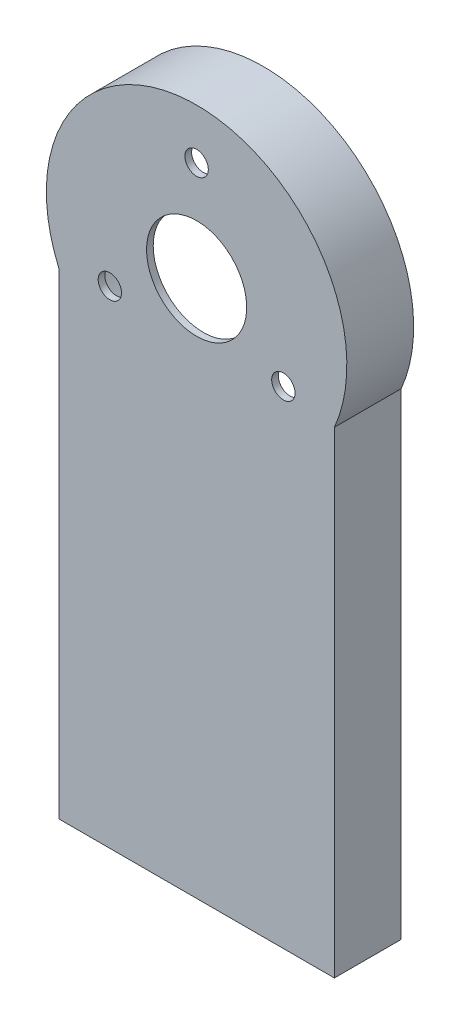
ISO-10303-21;
HEADER;
FILE_DESCRIPTION(('STEP AP214'),'2;1');
FILE_NAME('part.step','',(''),(''),'','','');
FILE_SCHEMA(('AUTOMOTIVE_DESIGN { 1 0 10303 214 1 1 1 1 }'));
ENDSEC;
DATA;
#1=APPLICATION_CONTEXT('core data for automotive mechanical design processes');
#2=APPLICATION_PROTOCOL_DEFINITION('international standard','automotive_design',2000,#1);
#3=PRODUCT_CONTEXT('',#1,'mechanical');
#4=PRODUCT('Part','Part','',(#3));
#5=PRODUCT_RELATED_PRODUCT_CATEGORY('part','',(#4));
#6=PRODUCT_DEFINITION_FORMATION('','',#4);
#7=PRODUCT_DEFINITION_CONTEXT('part definition',#1,'design');
#8=PRODUCT_DEFINITION('design','',#6,#7);
#9=PRODUCT_DEFINITION_SHAPE('','',#8);
#10=(LENGTH_UNIT() NAMED_UNIT(*) SI_UNIT(.MILLI.,.METRE.));
#11=(NAMED_UNIT(*) PLANE_ANGLE_UNIT() SI_UNIT($,.RADIAN.));
#12=(NAMED_UNIT(*) SI_UNIT($,.STERADIAN.) SOLID_ANGLE_UNIT());
#13=UNCERTAINTY_MEASURE_WITH_UNIT(LENGTH_MEASURE(1.E-05),#10,'distance_accuracy_value','');
#14=(GEOMETRIC_REPRESENTATION_CONTEXT(3) GLOBAL_UNCERTAINTY_ASSIGNED_CONTEXT((#13)) GLOBAL_UNIT_ASSIGNED_CONTEXT((#10,
#11,#12)) REPRESENTATION_CONTEXT('',''));
#15=CARTESIAN_POINT('',(0.,0.,0.));
#16=DIRECTION('',(0.,0.,1.));
#17=DIRECTION('',(1.,0.,0.));
#18=AXIS2_PLACEMENT_3D('',#15,#16,#17);
#19=CARTESIAN_POINT('',(12.9903810567656,-7.50000000000056,10.));
#20=DIRECTION('',(0.,0.,-1.));
#21=DIRECTION('',(-1.,0.,0.));
#22=AXIS2_PLACEMENT_3D('',#19,#20,#21);
#23=CYLINDRICAL_SURFACE('',#22,1.75000000000121);
#24=CARTESIAN_POINT('',(12.9903810567656,-7.50000000000056,10.));
#25=DIRECTION('',(0.,0.,-1.));
#26=DIRECTION('',(-1.,0.,0.));
#27=AXIS2_PLACEMENT_3D('',#24,#25,#26);
#28=CIRCLE('',#27,1.75000000000121);
#29=CARTESIAN_POINT('',(11.2403810567644,-7.50000000000056,10.));
#30=VERTEX_POINT('',#29);
#31=EDGE_CURVE('E133',#30,#30,#28,.T.);
#32=ORIENTED_EDGE('',*,*,#31,.F.);
#33=EDGE_LOOP('',(#32));
#34=FACE_BOUND('',#33,.T.);
#35=CARTESIAN_POINT('',(12.9903810567656,-7.50000000000056,9.));
#36=DIRECTION('',(0.,0.,-1.));
#37=DIRECTION('',(-1.,0.,0.));
#38=AXIS2_PLACEMENT_3D('',#35,#36,#37);
#39=CIRCLE('',#38,1.75000000000121);
#40=CARTESIAN_POINT('',(11.2403810567644,-7.50000000000056,9.));
#41=VERTEX_POINT('',#40);
#42=EDGE_CURVE('E119',#41,#41,#39,.F.);
#43=ORIENTED_EDGE('',*,*,#42,.F.);
#44=EDGE_LOOP('',(#43));
#45=FACE_BOUND('',#44,.T.);
#46=ADVANCED_FACE('F37',(#34,#45),#23,.F.);
#47=CARTESIAN_POINT('',(-12.9903810567675,-7.49999999999945,10.));
#48=DIRECTION('',(0.,0.,-1.));
#49=DIRECTION('',(-1.,0.,0.));
#50=AXIS2_PLACEMENT_3D('',#47,#48,#49);
#51=CYLINDRICAL_SURFACE('',#50,1.75000000000082);
#52=CARTESIAN_POINT('',(-12.9903810567675,-7.49999999999945,10.));
#53=DIRECTION('',(0.,0.,-1.));
#54=DIRECTION('',(-1.,0.,0.));
#55=AXIS2_PLACEMENT_3D('',#52,#53,#54);
#56=CIRCLE('',#55,1.75000000000082);
#57=CARTESIAN_POINT('',(-14.7403810567684,-7.49999999999945,10.));
#58=VERTEX_POINT('',#57);
#59=EDGE_CURVE('E136',#58,#58,#56,.T.);
#60=ORIENTED_EDGE('',*,*,#59,.F.);
#61=EDGE_LOOP('',(#60));
#62=FACE_BOUND('',#61,.T.);
#63=CARTESIAN_POINT('',(-12.9903810567675,-7.49999999999945,9.));
#64=DIRECTION('',(0.,0.,-1.));
#65=DIRECTION('',(-1.,0.,0.));
#66=AXIS2_PLACEMENT_3D('',#63,#64,#65);
#67=CIRCLE('',#66,1.75000000000082);
#68=CARTESIAN_POINT('',(-14.7403810567684,-7.49999999999945,9.));
#69=VERTEX_POINT('',#68);
#70=EDGE_CURVE('E114',#69,#69,#67,.F.);
#71=ORIENTED_EDGE('',*,*,#70,.F.);
#72=EDGE_LOOP('',(#71));
#73=FACE_BOUND('',#72,.T.);
#74=ADVANCED_FACE('F145',(#62,#73),#51,.F.);
#75=CARTESIAN_POINT('',(0.,15.,10.));
#76=DIRECTION('',(0.,0.,-1.));
#77=DIRECTION('',(-1.,0.,0.));
#78=AXIS2_PLACEMENT_3D('',#75,#76,#77);
#79=CYLINDRICAL_SURFACE('',#78,1.75);
#80=CARTESIAN_POINT('',(0.,15.,10.));
#81=DIRECTION('',(0.,0.,-1.));
#82=DIRECTION('',(-1.,0.,0.));
#83=AXIS2_PLACEMENT_3D('',#80,#81,#82);
#84=CIRCLE('',#83,1.75);
#85=CARTESIAN_POINT('',(-1.75,15.,10.));
#86=VERTEX_POINT('',#85);
#87=EDGE_CURVE('E107',#86,#86,#84,.T.);
#88=ORIENTED_EDGE('',*,*,#87,.F.);
#89=EDGE_LOOP('',(#88));
#90=FACE_BOUND('',#89,.T.);
#91=CARTESIAN_POINT('',(0.,15.,9.));
#92=DIRECTION('',(0.,0.,-1.));
#93=DIRECTION('',(-1.,0.,0.));
#94=AXIS2_PLACEMENT_3D('',#91,#92,#93);
#95=CIRCLE('',#94,1.75);
#96=CARTESIAN_POINT('',(-1.75,15.,9.));
#97=VERTEX_POINT('',#96);
#98=EDGE_CURVE('E112',#97,#97,#95,.F.);
#99=ORIENTED_EDGE('',*,*,#98,.F.);
#100=EDGE_LOOP('',(#99));
#101=FACE_BOUND('',#100,.T.);
#102=ADVANCED_FACE('F169',(#90,#101),#79,.F.);
#103=CARTESIAN_POINT('',(0.,0.,10.));
#104=DIRECTION('',(0.,0.,-1.));
#105=DIRECTION('',(-1.,0.,0.));
#106=AXIS2_PLACEMENT_3D('',#103,#104,#105);
#107=CYLINDRICAL_SURFACE('',#106,22.5);
#108=CARTESIAN_POINT('',(0.,0.,0.));
#109=DIRECTION('',(0.,0.,1.));
#110=DIRECTION('',(1.,0.,0.));
#111=AXIS2_PLACEMENT_3D('',#108,#109,#110);
#112=CIRCLE('',#111,22.5);
#113=CARTESIAN_POINT('',(20.6317649294689,-8.97665170846776,0.));
#114=VERTEX_POINT('',#113);
#115=CARTESIAN_POINT('',(-20.6317649294689,-8.97665170846776,0.));
#116=VERTEX_POINT('',#115);
#117=EDGE_CURVE('E104',#114,#116,#112,.T.);
#118=ORIENTED_EDGE('',*,*,#117,.T.);
#119=DIRECTION('',(0.,0.,-1.));
#120=VECTOR('',#119,1.);
#121=CARTESIAN_POINT('',(-20.6317649294689,-8.97665170846776,10.));
#122=LINE('',#121,#120);
#123=CARTESIAN_POINT('',(-20.6317649294689,-8.97665170846776,10.));
#124=VERTEX_POINT('',#123);
#125=EDGE_CURVE('E11',#124,#116,#122,.T.);
#126=ORIENTED_EDGE('',*,*,#125,.F.);
#127=CARTESIAN_POINT('',(0.,0.,10.));
#128=DIRECTION('',(0.,0.,1.));
#129=DIRECTION('',(1.,0.,0.));
#130=AXIS2_PLACEMENT_3D('',#127,#128,#129);
#131=CIRCLE('',#130,22.5);
#132=CARTESIAN_POINT('',(20.6317649294689,-8.97665170846776,10.));
#133=VERTEX_POINT('',#132);
#134=EDGE_CURVE('E91',#133,#124,#131,.T.);
#135=ORIENTED_EDGE('',*,*,#134,.F.);
#136=DIRECTION('',(0.,0.,-1.));
#137=VECTOR('',#136,1.);
#138=CARTESIAN_POINT('',(20.6317649294689,-8.97665170846776,10.));
#139=LINE('',#138,#137);
#140=EDGE_CURVE('E100',#133,#114,#139,.T.);
#141=ORIENTED_EDGE('',*,*,#140,.T.);
#142=EDGE_LOOP('',(#118,#126,#135,#141));
#143=FACE_BOUND('',#142,.T.);
#144=ADVANCED_FACE('F39',(#143),#107,.T.);
#145=CARTESIAN_POINT('',(-20.6317649294689,-8.97665170846776,10.));
#146=DIRECTION('',(1.,0.,0.));
#147=DIRECTION('',(0.,1.,0.));
#148=AXIS2_PLACEMENT_3D('',#145,#146,#147);
#149=PLANE('',#148);
#150=DIRECTION('',(0.,-1.,0.));
#151=VECTOR('',#150,1.);
#152=CARTESIAN_POINT('',(-20.6317649294689,-8.97665170846776,0.));
#153=LINE('',#152,#151);
#154=CARTESIAN_POINT('',(-20.6317649294689,-80.4,0.));
#155=VERTEX_POINT('',#154);
#156=EDGE_CURVE('E95',#116,#155,#153,.T.);
#157=ORIENTED_EDGE('',*,*,#156,.T.);
#158=DIRECTION('',(0.,0.,-1.));
#159=VECTOR('',#158,1.);
#160=CARTESIAN_POINT('',(-20.6317649294689,-80.4,10.));
#161=LINE('',#160,#159);
#162=CARTESIAN_POINT('',(-20.6317649294689,-80.4,10.));
#163=VERTEX_POINT('',#162);
#164=EDGE_CURVE('E47',#163,#155,#161,.T.);
#165=ORIENTED_EDGE('',*,*,#164,.F.);
#166=DIRECTION('',(0.,-1.,0.));
#167=VECTOR('',#166,1.);
#168=CARTESIAN_POINT('',(-20.6317649294689,-8.97665170846776,10.));
#169=LINE('',#168,#167);
#170=EDGE_CURVE('E86',#124,#163,#169,.T.);
#171=ORIENTED_EDGE('',*,*,#170,.F.);
#172=ORIENTED_EDGE('',*,*,#125,.T.);
#173=EDGE_LOOP('',(#157,#165,#171,#172));
#174=FACE_BOUND('',#173,.T.);
#175=ADVANCED_FACE('F94',(#174),#149,.F.);
#176=CARTESIAN_POINT('',(-20.6317649294689,-80.4,10.));
#177=DIRECTION('',(0.,1.,0.));
#178=DIRECTION('',(0.,0.,1.));
#179=AXIS2_PLACEMENT_3D('',#176,#177,#178);
#180=PLANE('',#179);
#181=DIRECTION('',(1.,0.,0.));
#182=VECTOR('',#181,1.);
#183=CARTESIAN_POINT('',(-20.6317649294689,-80.4,0.));
#184=LINE('',#183,#182);
#185=CARTESIAN_POINT('',(20.6317649294689,-80.4,0.));
#186=VERTEX_POINT('',#185);
#187=EDGE_CURVE('E73',#155,#186,#184,.T.);
#188=ORIENTED_EDGE('',*,*,#187,.T.);
#189=DIRECTION('',(0.,0.,-1.));
#190=VECTOR('',#189,1.);
#191=CARTESIAN_POINT('',(20.6317649294689,-80.4,10.));
#192=LINE('',#191,#190);
#193=CARTESIAN_POINT('',(20.6317649294689,-80.4,10.));
#194=VERTEX_POINT('',#193);
#195=EDGE_CURVE('E96',#194,#186,#192,.T.);
#196=ORIENTED_EDGE('',*,*,#195,.F.);
#197=DIRECTION('',(1.,0.,0.));
#198=VECTOR('',#197,1.);
#199=CARTESIAN_POINT('',(-20.6317649294689,-80.4,10.));
#200=LINE('',#199,#198);
#201=EDGE_CURVE('E89',#163,#194,#200,.T.);
#202=ORIENTED_EDGE('',*,*,#201,.F.);
#203=ORIENTED_EDGE('',*,*,#164,.T.);
#204=EDGE_LOOP('',(#188,#196,#202,#203));
#205=FACE_BOUND('',#204,.T.);
#206=ADVANCED_FACE('F98',(#205),#180,.F.);
#207=CARTESIAN_POINT('',(20.6317649294689,-8.97665170846776,10.));
#208=DIRECTION('',(-1.,0.,0.));
#209=DIRECTION('',(0.,-1.,0.));
#210=AXIS2_PLACEMENT_3D('',#207,#208,#209);
#211=PLANE('',#210);
#212=DIRECTION('',(0.,1.,0.));
#213=VECTOR('',#212,1.);
#214=CARTESIAN_POINT('',(20.6317649294689,-8.97665170846776,0.));
#215=LINE('',#214,#213);
#216=EDGE_CURVE('E79',#186,#114,#215,.T.);
#217=ORIENTED_EDGE('',*,*,#216,.T.);
#218=ORIENTED_EDGE('',*,*,#140,.F.);
#219=DIRECTION('',(0.,1.,0.));
#220=VECTOR('',#219,1.);
#221=CARTESIAN_POINT('',(20.6317649294689,-8.97665170846776,10.));
#222=LINE('',#221,#220);
#223=EDGE_CURVE('E56',#194,#133,#222,.T.);
#224=ORIENTED_EDGE('',*,*,#223,.F.);
#225=ORIENTED_EDGE('',*,*,#195,.T.);
#226=EDGE_LOOP('',(#217,#218,#224,#225));
#227=FACE_BOUND('',#226,.T.);
#228=ADVANCED_FACE('F176',(#227),#211,.F.);
#229=CARTESIAN_POINT('',(0.,0.,10.));
#230=DIRECTION('',(0.,0.,1.));
#231=DIRECTION('',(1.,0.,0.));
#232=AXIS2_PLACEMENT_3D('',#229,#230,#231);
#233=PLANE('',#232);
#234=CARTESIAN_POINT('',(0.,0.,10.));
#235=DIRECTION('',(0.,0.,-1.));
#236=DIRECTION('',(-1.,0.,0.));
#237=AXIS2_PLACEMENT_3D('',#234,#235,#236);
#238=CIRCLE('',#237,7.5);
#239=CARTESIAN_POINT('',(-7.5,0.,10.));
#240=VERTEX_POINT('',#239);
#241=EDGE_CURVE('E129',#240,#240,#238,.T.);
#242=ORIENTED_EDGE('',*,*,#241,.T.);
#243=EDGE_LOOP('',(#242));
#244=FACE_BOUND('',#243,.T.);
#245=ORIENTED_EDGE('',*,*,#87,.T.);
#246=EDGE_LOOP('',(#245));
#247=FACE_BOUND('',#246,.T.);
#248=ORIENTED_EDGE('',*,*,#59,.T.);
#249=EDGE_LOOP('',(#248));
#250=FACE_BOUND('',#249,.T.);
#251=ORIENTED_EDGE('',*,*,#31,.T.);
#252=EDGE_LOOP('',(#251));
#253=FACE_BOUND('',#252,.T.);
#254=ORIENTED_EDGE('',*,*,#134,.T.);
#255=ORIENTED_EDGE('',*,*,#170,.T.);
#256=ORIENTED_EDGE('',*,*,#201,.T.);
#257=ORIENTED_EDGE('',*,*,#223,.T.);
#258=EDGE_LOOP('',(#254,#255,#256,#257));
#259=FACE_BOUND('',#258,.T.);
#260=ADVANCED_FACE('F87',(#244,#247,#250,#253,#259),#233,.T.);
#261=CARTESIAN_POINT('',(0.,0.,0.));
#262=DIRECTION('',(0.,0.,1.));
#263=DIRECTION('',(1.,0.,0.));
#264=AXIS2_PLACEMENT_3D('',#261,#262,#263);
#265=PLANE('',#264);
#266=CARTESIAN_POINT('',(0.,0.,0.));
#267=DIRECTION('',(0.,0.,-1.));
#268=DIRECTION('',(-1.,0.,0.));
#269=AXIS2_PLACEMENT_3D('',#266,#267,#268);
#270=CIRCLE('',#269,21.1);
#271=CARTESIAN_POINT('',(-21.1,0.,0.));
#272=VERTEX_POINT('',#271);
#273=EDGE_CURVE('E122',#272,#272,#270,.T.);
#274=ORIENTED_EDGE('',*,*,#273,.F.);
#275=EDGE_LOOP('',(#274));
#276=FACE_BOUND('',#275,.T.);
#277=ORIENTED_EDGE('',*,*,#117,.F.);
#278=ORIENTED_EDGE('',*,*,#216,.F.);
#279=ORIENTED_EDGE('',*,*,#187,.F.);
#280=ORIENTED_EDGE('',*,*,#156,.F.);
#281=EDGE_LOOP('',(#277,#278,#279,#280));
#282=FACE_BOUND('',#281,.T.);
#283=ADVANCED_FACE('F152',(#276,#282),#265,.F.);
#284=CARTESIAN_POINT('',(0.,0.,9.));
#285=DIRECTION('',(0.,0.,-1.));
#286=DIRECTION('',(-1.,0.,0.));
#287=AXIS2_PLACEMENT_3D('',#284,#285,#286);
#288=PLANE('',#287);
#289=CARTESIAN_POINT('',(0.,0.,9.));
#290=DIRECTION('',(0.,0.,-1.));
#291=DIRECTION('',(-1.,0.,0.));
#292=AXIS2_PLACEMENT_3D('',#289,#290,#291);
#293=CIRCLE('',#292,7.5);
#294=CARTESIAN_POINT('',(-7.5,0.,9.));
#295=VERTEX_POINT('',#294);
#296=EDGE_CURVE('E41',#295,#295,#293,.T.);
#297=ORIENTED_EDGE('',*,*,#296,.F.);
#298=EDGE_LOOP('',(#297));
#299=FACE_BOUND('',#298,.T.);
#300=CARTESIAN_POINT('',(0.,0.,9.));
#301=DIRECTION('',(0.,0.,-1.));
#302=DIRECTION('',(-1.,0.,0.));
#303=AXIS2_PLACEMENT_3D('',#300,#301,#302);
#304=CIRCLE('',#303,21.1);
#305=CARTESIAN_POINT('',(-21.1,0.,9.));
#306=VERTEX_POINT('',#305);
#307=EDGE_CURVE('E115',#306,#306,#304,.T.);
#308=ORIENTED_EDGE('',*,*,#307,.T.);
#309=EDGE_LOOP('',(#308));
#310=FACE_BOUND('',#309,.T.);
#311=ORIENTED_EDGE('',*,*,#98,.T.);
#312=EDGE_LOOP('',(#311));
#313=FACE_BOUND('',#312,.T.);
#314=ORIENTED_EDGE('',*,*,#70,.T.);
#315=EDGE_LOOP('',(#314));
#316=FACE_BOUND('',#315,.T.);
#317=ORIENTED_EDGE('',*,*,#42,.T.);
#318=EDGE_LOOP('',(#317));
#319=FACE_BOUND('',#318,.T.);
#320=ADVANCED_FACE('F149',(#299,#310,#313,#316,#319),#288,.T.);
#321=CARTESIAN_POINT('',(0.,0.,9.));
#322=DIRECTION('',(0.,0.,-1.));
#323=DIRECTION('',(-1.,0.,0.));
#324=AXIS2_PLACEMENT_3D('',#321,#322,#323);
#325=CYLINDRICAL_SURFACE('',#324,21.1);
#326=ORIENTED_EDGE('',*,*,#307,.F.);
#327=EDGE_LOOP('',(#326));
#328=FACE_BOUND('',#327,.T.);
#329=ORIENTED_EDGE('',*,*,#273,.T.);
#330=EDGE_LOOP('',(#329));
#331=FACE_BOUND('',#330,.T.);
#332=ADVANCED_FACE('F151',(#328,#331),#325,.F.);
#333=CARTESIAN_POINT('',(0.,0.,10.));
#334=DIRECTION('',(0.,0.,-1.));
#335=DIRECTION('',(-1.,0.,0.));
#336=AXIS2_PLACEMENT_3D('',#333,#334,#335);
#337=CYLINDRICAL_SURFACE('',#336,7.5);
#338=ORIENTED_EDGE('',*,*,#296,.T.);
#339=EDGE_LOOP('',(#338));
#340=FACE_BOUND('',#339,.T.);
#341=ORIENTED_EDGE('',*,*,#241,.F.);
#342=EDGE_LOOP('',(#341));
#343=FACE_BOUND('',#342,.T.);
#344=ADVANCED_FACE('F160',(#340,#343),#337,.F.);
#345=CLOSED_SHELL('',(#46,#74,#102,#144,#175,#206,#228,#260,#283,#320,#332,#344));
#346=MANIFOLD_SOLID_BREP('B2',#345);
#347=ADVANCED_BREP_SHAPE_REPRESENTATION('',(#18,#346),#14);
#348=SHAPE_DEFINITION_REPRESENTATION(#9,#347);
ENDSEC;
END-ISO-10303-21;
